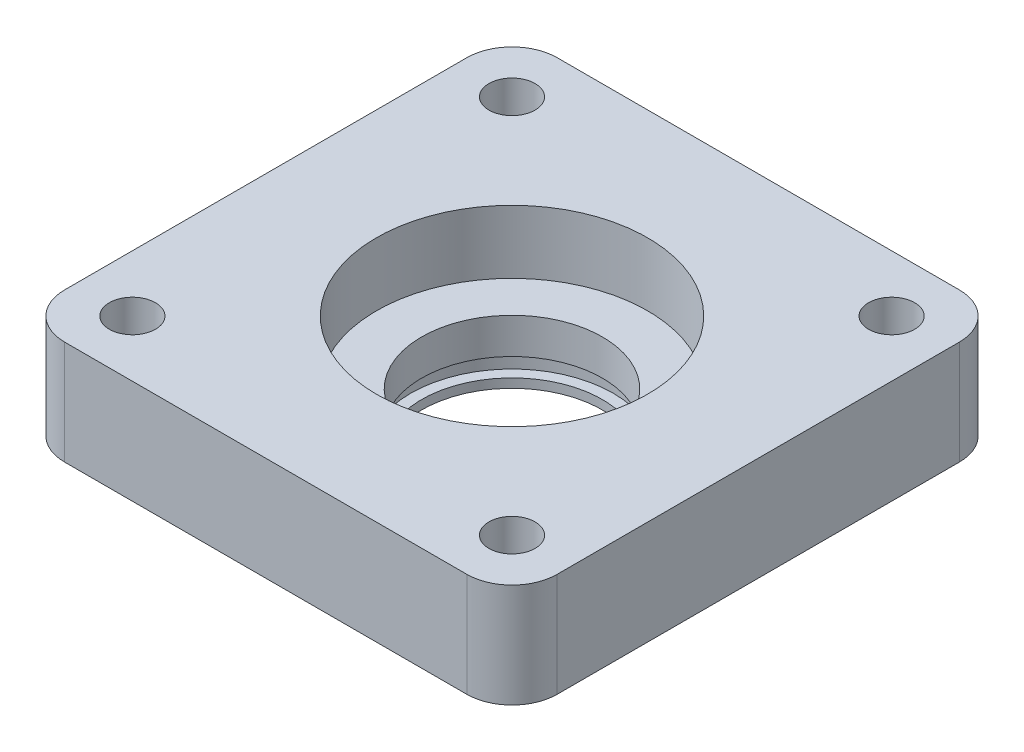
ISO-10303-21;
HEADER;
FILE_DESCRIPTION(('STEP AP214'),'2;1');
FILE_NAME('part.step','',(''),(''),'','','');
FILE_SCHEMA(('AUTOMOTIVE_DESIGN { 1 0 10303 214 1 1 1 1 }'));
ENDSEC;
DATA;
#1=APPLICATION_CONTEXT('core data for automotive mechanical design processes');
#2=APPLICATION_PROTOCOL_DEFINITION('international standard','automotive_design',2000,#1);
#3=PRODUCT_CONTEXT('',#1,'mechanical');
#4=PRODUCT('Part','Part','',(#3));
#5=PRODUCT_RELATED_PRODUCT_CATEGORY('part','',(#4));
#6=PRODUCT_DEFINITION_FORMATION('','',#4);
#7=PRODUCT_DEFINITION_CONTEXT('part definition',#1,'design');
#8=PRODUCT_DEFINITION('design','',#6,#7);
#9=PRODUCT_DEFINITION_SHAPE('','',#8);
#10=(LENGTH_UNIT() NAMED_UNIT(*) SI_UNIT(.MILLI.,.METRE.));
#11=(NAMED_UNIT(*) PLANE_ANGLE_UNIT() SI_UNIT($,.RADIAN.));
#12=(NAMED_UNIT(*) SI_UNIT($,.STERADIAN.) SOLID_ANGLE_UNIT());
#13=UNCERTAINTY_MEASURE_WITH_UNIT(LENGTH_MEASURE(1.E-05),#10,'distance_accuracy_value','');
#14=(GEOMETRIC_REPRESENTATION_CONTEXT(3) GLOBAL_UNCERTAINTY_ASSIGNED_CONTEXT((#13)) GLOBAL_UNIT_ASSIGNED_CONTEXT((#10,
#11,#12)) REPRESENTATION_CONTEXT('',''));
#15=CARTESIAN_POINT('',(0.,0.,0.));
#16=DIRECTION('',(0.,0.,1.));
#17=DIRECTION('',(1.,0.,0.));
#18=AXIS2_PLACEMENT_3D('',#15,#16,#17);
#19=CARTESIAN_POINT('',(0.,2.,20.));
#20=DIRECTION('',(0.,1.,0.));
#21=DIRECTION('',(0.,0.,1.));
#22=AXIS2_PLACEMENT_3D('',#19,#20,#21);
#23=PLANE('',#22);
#24=CARTESIAN_POINT('',(0.,2.,0.));
#25=DIRECTION('',(0.,-1.,0.));
#26=DIRECTION('',(0.,0.,-1.));
#27=AXIS2_PLACEMENT_3D('',#24,#25,#26);
#28=CIRCLE('',#27,22.4);
#29=CARTESIAN_POINT('',(0.,2.,-22.4));
#30=VERTEX_POINT('',#29);
#31=EDGE_CURVE('E19',#30,#30,#28,.F.);
#32=ORIENTED_EDGE('',*,*,#31,.T.);
#33=EDGE_LOOP('',(#32));
#34=FACE_BOUND('',#33,.T.);
#35=CARTESIAN_POINT('',(0.,2.,0.));
#36=DIRECTION('',(0.,1.,0.));
#37=DIRECTION('',(0.,0.,1.));
#38=AXIS2_PLACEMENT_3D('',#35,#36,#37);
#39=CIRCLE('',#38,20.);
#40=CARTESIAN_POINT('',(0.,2.,20.));
#41=VERTEX_POINT('',#40);
#42=EDGE_CURVE('E180',#41,#41,#39,.F.);
#43=ORIENTED_EDGE('',*,*,#42,.T.);
#44=EDGE_LOOP('',(#43));
#45=FACE_BOUND('',#44,.T.);
#46=ADVANCED_FACE('F16',(#34,#45),#23,.T.);
#47=CARTESIAN_POINT('',(0.,0.,0.));
#48=DIRECTION('',(0.,-1.,0.));
#49=DIRECTION('',(0.,0.,-1.));
#50=AXIS2_PLACEMENT_3D('',#47,#48,#49);
#51=CYLINDRICAL_SURFACE('',#50,22.4);
#52=ORIENTED_EDGE('',*,*,#31,.F.);
#53=EDGE_LOOP('',(#52));
#54=FACE_BOUND('',#53,.T.);
#55=CARTESIAN_POINT('',(0.,6.1,0.));
#56=DIRECTION('',(0.,-1.,0.));
#57=DIRECTION('',(0.,0.,-1.));
#58=AXIS2_PLACEMENT_3D('',#55,#56,#57);
#59=CIRCLE('',#58,22.4);
#60=CARTESIAN_POINT('',(0.,6.1,-22.4));
#61=VERTEX_POINT('',#60);
#62=EDGE_CURVE('E178',#61,#61,#59,.T.);
#63=ORIENTED_EDGE('',*,*,#62,.F.);
#64=EDGE_LOOP('',(#63));
#65=FACE_BOUND('',#64,.T.);
#66=ADVANCED_FACE('F188',(#54,#65),#51,.F.);
#67=CARTESIAN_POINT('',(0.,0.,0.));
#68=DIRECTION('',(0.,1.,0.));
#69=DIRECTION('',(0.,0.,1.));
#70=AXIS2_PLACEMENT_3D('',#67,#68,#69);
#71=CYLINDRICAL_SURFACE('',#70,20.);
#72=ORIENTED_EDGE('',*,*,#42,.F.);
#73=EDGE_LOOP('',(#72));
#74=FACE_BOUND('',#73,.T.);
#75=CARTESIAN_POINT('',(0.,0.,0.));
#76=DIRECTION('',(0.,1.,0.));
#77=DIRECTION('',(0.,0.,1.));
#78=AXIS2_PLACEMENT_3D('',#75,#76,#77);
#79=CIRCLE('',#78,20.);
#80=CARTESIAN_POINT('',(0.,0.,20.));
#81=VERTEX_POINT('',#80);
#82=EDGE_CURVE('E175',#81,#81,#79,.T.);
#83=ORIENTED_EDGE('',*,*,#82,.F.);
#84=EDGE_LOOP('',(#83));
#85=FACE_BOUND('',#84,.T.);
#86=ADVANCED_FACE('F191',(#74,#85),#71,.F.);
#87=CARTESIAN_POINT('',(0.,6.1,20.));
#88=DIRECTION('',(0.,-1.,0.));
#89=DIRECTION('',(0.,0.,-1.));
#90=AXIS2_PLACEMENT_3D('',#87,#88,#89);
#91=PLANE('',#90);
#92=CARTESIAN_POINT('',(0.,6.1,0.));
#93=DIRECTION('',(0.,1.,0.));
#94=DIRECTION('',(0.,0.,1.));
#95=AXIS2_PLACEMENT_3D('',#92,#93,#94);
#96=CIRCLE('',#95,20.);
#97=CARTESIAN_POINT('',(0.,6.1,20.));
#98=VERTEX_POINT('',#97);
#99=EDGE_CURVE('E172',#98,#98,#96,.T.);
#100=ORIENTED_EDGE('',*,*,#99,.T.);
#101=EDGE_LOOP('',(#100));
#102=FACE_BOUND('',#101,.T.);
#103=ORIENTED_EDGE('',*,*,#62,.T.);
#104=EDGE_LOOP('',(#103));
#105=FACE_BOUND('',#104,.T.);
#106=ADVANCED_FACE('F194',(#102,#105),#91,.T.);
#107=CARTESIAN_POINT('',(0.,0.,0.));
#108=DIRECTION('',(0.,-1.,0.));
#109=DIRECTION('',(0.,0.,-1.));
#110=AXIS2_PLACEMENT_3D('',#107,#108,#109);
#111=PLANE('',#110);
#112=CARTESIAN_POINT('',(0.,0.,0.));
#113=DIRECTION('',(0.,-1.,0.));
#114=DIRECTION('',(0.,0.,-1.));
#115=AXIS2_PLACEMENT_3D('',#112,#113,#114);
#116=CIRCLE('',#115,30.);
#117=CARTESIAN_POINT('',(0.,0.,-30.));
#118=VERTEX_POINT('',#117);
#119=EDGE_CURVE('E169',#118,#118,#116,.F.);
#120=ORIENTED_EDGE('',*,*,#119,.F.);
#121=EDGE_LOOP('',(#120));
#122=FACE_BOUND('',#121,.T.);
#123=ORIENTED_EDGE('',*,*,#82,.T.);
#124=EDGE_LOOP('',(#123));
#125=FACE_BOUND('',#124,.T.);
#126=ADVANCED_FACE('F196',(#122,#125),#111,.T.);
#127=CARTESIAN_POINT('',(0.,0.,0.));
#128=DIRECTION('',(0.,1.,0.));
#129=DIRECTION('',(0.,0.,1.));
#130=AXIS2_PLACEMENT_3D('',#127,#128,#129);
#131=CYLINDRICAL_SURFACE('',#130,20.);
#132=ORIENTED_EDGE('',*,*,#99,.F.);
#133=EDGE_LOOP('',(#132));
#134=FACE_BOUND('',#133,.T.);
#135=CARTESIAN_POINT('',(0.,14.,0.));
#136=DIRECTION('',(0.,1.,0.));
#137=DIRECTION('',(0.,0.,1.));
#138=AXIS2_PLACEMENT_3D('',#135,#136,#137);
#139=CIRCLE('',#138,20.);
#140=CARTESIAN_POINT('',(0.,14.,20.));
#141=VERTEX_POINT('',#140);
#142=EDGE_CURVE('E166',#141,#141,#139,.T.);
#143=ORIENTED_EDGE('',*,*,#142,.T.);
#144=EDGE_LOOP('',(#143));
#145=FACE_BOUND('',#144,.T.);
#146=ADVANCED_FACE('F205',(#134,#145),#131,.F.);
#147=CARTESIAN_POINT('',(0.,5.,0.));
#148=DIRECTION('',(0.,-1.,0.));
#149=DIRECTION('',(0.,0.,-1.));
#150=AXIS2_PLACEMENT_3D('',#147,#148,#149);
#151=CYLINDRICAL_SURFACE('',#150,30.);
#152=CARTESIAN_POINT('',(0.,5.,0.));
#153=DIRECTION('',(0.,-1.,0.));
#154=DIRECTION('',(0.,0.,-1.));
#155=AXIS2_PLACEMENT_3D('',#152,#153,#154);
#156=CIRCLE('',#155,30.);
#157=CARTESIAN_POINT('',(0.,5.,-30.));
#158=VERTEX_POINT('',#157);
#159=EDGE_CURVE('E163',#158,#158,#156,.F.);
#160=ORIENTED_EDGE('',*,*,#159,.F.);
#161=EDGE_LOOP('',(#160));
#162=FACE_BOUND('',#161,.T.);
#163=ORIENTED_EDGE('',*,*,#119,.T.);
#164=EDGE_LOOP('',(#163));
#165=FACE_BOUND('',#164,.T.);
#166=ADVANCED_FACE('F272',(#162,#165),#151,.T.);
#167=CARTESIAN_POINT('',(0.,14.,0.));
#168=DIRECTION('',(0.,-1.,0.));
#169=DIRECTION('',(0.,0.,-1.));
#170=AXIS2_PLACEMENT_3D('',#167,#168,#169);
#171=PLANE('',#170);
#172=CARTESIAN_POINT('',(0.,14.,0.));
#173=DIRECTION('',(0.,1.,0.));
#174=DIRECTION('',(0.,0.,1.));
#175=AXIS2_PLACEMENT_3D('',#172,#173,#174);
#176=CIRCLE('',#175,30.);
#177=CARTESIAN_POINT('',(0.,14.,30.));
#178=VERTEX_POINT('',#177);
#179=EDGE_CURVE('E93',#178,#178,#176,.T.);
#180=ORIENTED_EDGE('',*,*,#179,.T.);
#181=EDGE_LOOP('',(#180));
#182=FACE_BOUND('',#181,.T.);
#183=ORIENTED_EDGE('',*,*,#142,.F.);
#184=EDGE_LOOP('',(#183));
#185=FACE_BOUND('',#184,.T.);
#186=ADVANCED_FACE('F269',(#182,#185),#171,.F.);
#187=CARTESIAN_POINT('',(0.,5.,0.));
#188=DIRECTION('',(0.,-1.,0.));
#189=DIRECTION('',(0.,0.,-1.));
#190=AXIS2_PLACEMENT_3D('',#187,#188,#189);
#191=PLANE('',#190);
#192=DIRECTION('',(0.,0.,-1.));
#193=VECTOR('',#192,1.);
#194=CARTESIAN_POINT('',(-54.5,5.,54.5));
#195=LINE('',#194,#193);
#196=CARTESIAN_POINT('',(-54.5,5.,44.5));
#197=VERTEX_POINT('',#196);
#198=CARTESIAN_POINT('',(-54.5,5.,-44.5));
#199=VERTEX_POINT('',#198);
#200=EDGE_CURVE('E116',#197,#199,#195,.T.);
#201=ORIENTED_EDGE('',*,*,#200,.T.);
#202=CARTESIAN_POINT('',(-44.5,5.,-44.5));
#203=DIRECTION('',(0.,-1.,0.));
#204=DIRECTION('',(0.,0.,-1.));
#205=AXIS2_PLACEMENT_3D('',#202,#203,#204);
#206=CIRCLE('',#205,10.);
#207=CARTESIAN_POINT('',(-44.5,5.,-54.5));
#208=VERTEX_POINT('',#207);
#209=EDGE_CURVE('E117',#208,#199,#206,.F.);
#210=ORIENTED_EDGE('',*,*,#209,.F.);
#211=DIRECTION('',(1.,0.,0.));
#212=VECTOR('',#211,1.);
#213=CARTESIAN_POINT('',(-54.5,5.,-54.5));
#214=LINE('',#213,#212);
#215=CARTESIAN_POINT('',(44.5,5.,-54.5));
#216=VERTEX_POINT('',#215);
#217=EDGE_CURVE('E111',#208,#216,#214,.T.);
#218=ORIENTED_EDGE('',*,*,#217,.T.);
#219=CARTESIAN_POINT('',(44.5,5.,-44.5));
#220=DIRECTION('',(0.,-1.,0.));
#221=DIRECTION('',(0.,0.,-1.));
#222=AXIS2_PLACEMENT_3D('',#219,#220,#221);
#223=CIRCLE('',#222,10.);
#224=CARTESIAN_POINT('',(54.5,5.,-44.5));
#225=VERTEX_POINT('',#224);
#226=EDGE_CURVE('E114',#225,#216,#223,.F.);
#227=ORIENTED_EDGE('',*,*,#226,.F.);
#228=DIRECTION('',(0.,0.,1.));
#229=VECTOR('',#228,1.);
#230=CARTESIAN_POINT('',(54.5,5.,54.5));
#231=LINE('',#230,#229);
#232=CARTESIAN_POINT('',(54.5,5.,44.5));
#233=VERTEX_POINT('',#232);
#234=EDGE_CURVE('E87',#225,#233,#231,.T.);
#235=ORIENTED_EDGE('',*,*,#234,.T.);
#236=CARTESIAN_POINT('',(44.5,5.,44.5));
#237=DIRECTION('',(0.,-1.,0.));
#238=DIRECTION('',(0.,0.,-1.));
#239=AXIS2_PLACEMENT_3D('',#236,#237,#238);
#240=CIRCLE('',#239,10.);
#241=CARTESIAN_POINT('',(44.5,5.,54.5));
#242=VERTEX_POINT('',#241);
#243=EDGE_CURVE('E80',#242,#233,#240,.F.);
#244=ORIENTED_EDGE('',*,*,#243,.F.);
#245=DIRECTION('',(-1.,0.,0.));
#246=VECTOR('',#245,1.);
#247=CARTESIAN_POINT('',(-54.5,5.,54.5));
#248=LINE('',#247,#246);
#249=CARTESIAN_POINT('',(-44.5,5.,54.5));
#250=VERTEX_POINT('',#249);
#251=EDGE_CURVE('E85',#242,#250,#248,.T.);
#252=ORIENTED_EDGE('',*,*,#251,.T.);
#253=CARTESIAN_POINT('',(-44.5,5.,44.5));
#254=DIRECTION('',(0.,-1.,0.));
#255=DIRECTION('',(0.,0.,-1.));
#256=AXIS2_PLACEMENT_3D('',#253,#254,#255);
#257=CIRCLE('',#256,10.);
#258=EDGE_CURVE('E100',#197,#250,#257,.F.);
#259=ORIENTED_EDGE('',*,*,#258,.F.);
#260=EDGE_LOOP('',(#201,#210,#218,#227,#235,#244,#252,#259));
#261=FACE_BOUND('',#260,.T.);
#262=ORIENTED_EDGE('',*,*,#159,.T.);
#263=EDGE_LOOP('',(#262));
#264=FACE_BOUND('',#263,.T.);
#265=CARTESIAN_POINT('',(42.,5.,42.));
#266=DIRECTION('',(0.,1.,0.));
#267=DIRECTION('',(0.,0.,1.));
#268=AXIS2_PLACEMENT_3D('',#265,#266,#267);
#269=CIRCLE('',#268,5.1);
#270=CARTESIAN_POINT('',(42.,5.,47.1));
#271=VERTEX_POINT('',#270);
#272=EDGE_CURVE('E110',#271,#271,#269,.T.);
#273=ORIENTED_EDGE('',*,*,#272,.T.);
#274=EDGE_LOOP('',(#273));
#275=FACE_BOUND('',#274,.T.);
#276=CARTESIAN_POINT('',(42.,5.,-42.));
#277=DIRECTION('',(0.,1.,0.));
#278=DIRECTION('',(0.,0.,1.));
#279=AXIS2_PLACEMENT_3D('',#276,#277,#278);
#280=CIRCLE('',#279,5.1);
#281=CARTESIAN_POINT('',(42.,5.,-36.9));
#282=VERTEX_POINT('',#281);
#283=EDGE_CURVE('E148',#282,#282,#280,.T.);
#284=ORIENTED_EDGE('',*,*,#283,.T.);
#285=EDGE_LOOP('',(#284));
#286=FACE_BOUND('',#285,.T.);
#287=CARTESIAN_POINT('',(-42.,5.,42.));
#288=DIRECTION('',(0.,1.,0.));
#289=DIRECTION('',(0.,0.,1.));
#290=AXIS2_PLACEMENT_3D('',#287,#288,#289);
#291=CIRCLE('',#290,5.1);
#292=CARTESIAN_POINT('',(-42.,5.,47.1));
#293=VERTEX_POINT('',#292);
#294=EDGE_CURVE('E160',#293,#293,#291,.T.);
#295=ORIENTED_EDGE('',*,*,#294,.T.);
#296=EDGE_LOOP('',(#295));
#297=FACE_BOUND('',#296,.T.);
#298=CARTESIAN_POINT('',(-42.,5.,-42.));
#299=DIRECTION('',(0.,1.,0.));
#300=DIRECTION('',(0.,0.,1.));
#301=AXIS2_PLACEMENT_3D('',#298,#299,#300);
#302=CIRCLE('',#301,5.1);
#303=CARTESIAN_POINT('',(-42.,5.,-36.9));
#304=VERTEX_POINT('',#303);
#305=EDGE_CURVE('E145',#304,#304,#302,.T.);
#306=ORIENTED_EDGE('',*,*,#305,.T.);
#307=EDGE_LOOP('',(#306));
#308=FACE_BOUND('',#307,.T.);
#309=ADVANCED_FACE('F83',(#261,#264,#275,#286,#297,#308),#191,.T.);
#310=CARTESIAN_POINT('',(-42.,28.,42.));
#311=DIRECTION('',(0.,1.,0.));
#312=DIRECTION('',(0.,0.,1.));
#313=AXIS2_PLACEMENT_3D('',#310,#311,#312);
#314=CYLINDRICAL_SURFACE('',#313,5.1);
#315=ORIENTED_EDGE('',*,*,#294,.F.);
#316=EDGE_LOOP('',(#315));
#317=FACE_BOUND('',#316,.T.);
#318=CARTESIAN_POINT('',(-42.,28.,42.));
#319=DIRECTION('',(0.,1.,0.));
#320=DIRECTION('',(0.,0.,1.));
#321=AXIS2_PLACEMENT_3D('',#318,#319,#320);
#322=CIRCLE('',#321,5.1);
#323=CARTESIAN_POINT('',(-42.,28.,47.1));
#324=VERTEX_POINT('',#323);
#325=EDGE_CURVE('E142',#324,#324,#322,.T.);
#326=ORIENTED_EDGE('',*,*,#325,.T.);
#327=EDGE_LOOP('',(#326));
#328=FACE_BOUND('',#327,.T.);
#329=ADVANCED_FACE('F262',(#317,#328),#314,.F.);
#330=CARTESIAN_POINT('',(0.,14.,0.));
#331=DIRECTION('',(0.,1.,0.));
#332=DIRECTION('',(0.,0.,1.));
#333=AXIS2_PLACEMENT_3D('',#330,#331,#332);
#334=CYLINDRICAL_SURFACE('',#333,30.);
#335=CARTESIAN_POINT('',(0.,28.,0.));
#336=DIRECTION('',(0.,1.,0.));
#337=DIRECTION('',(0.,0.,1.));
#338=AXIS2_PLACEMENT_3D('',#335,#336,#337);
#339=CIRCLE('',#338,30.);
#340=CARTESIAN_POINT('',(0.,28.,30.));
#341=VERTEX_POINT('',#340);
#342=EDGE_CURVE('E139',#341,#341,#339,.T.);
#343=ORIENTED_EDGE('',*,*,#342,.T.);
#344=EDGE_LOOP('',(#343));
#345=FACE_BOUND('',#344,.T.);
#346=ORIENTED_EDGE('',*,*,#179,.F.);
#347=EDGE_LOOP('',(#346));
#348=FACE_BOUND('',#347,.T.);
#349=ADVANCED_FACE('F259',(#345,#348),#334,.F.);
#350=CARTESIAN_POINT('',(44.5,28.,44.5));
#351=DIRECTION('',(0.,-1.,0.));
#352=DIRECTION('',(0.,0.,-1.));
#353=AXIS2_PLACEMENT_3D('',#350,#351,#352);
#354=CYLINDRICAL_SURFACE('',#353,10.);
#355=ORIENTED_EDGE('',*,*,#243,.T.);
#356=DIRECTION('',(0.,1.,0.));
#357=VECTOR('',#356,1.);
#358=CARTESIAN_POINT('',(54.5,28.,44.5));
#359=LINE('',#358,#357);
#360=CARTESIAN_POINT('',(54.5,28.,44.5));
#361=VERTEX_POINT('',#360);
#362=EDGE_CURVE('E464',#233,#361,#359,.T.);
#363=ORIENTED_EDGE('',*,*,#362,.T.);
#364=CARTESIAN_POINT('',(44.5,28.,44.5));
#365=DIRECTION('',(0.,-1.,0.));
#366=DIRECTION('',(0.,0.,-1.));
#367=AXIS2_PLACEMENT_3D('',#364,#365,#366);
#368=CIRCLE('',#367,10.);
#369=CARTESIAN_POINT('',(44.5,28.,54.5));
#370=VERTEX_POINT('',#369);
#371=EDGE_CURVE('E104',#361,#370,#368,.T.);
#372=ORIENTED_EDGE('',*,*,#371,.T.);
#373=DIRECTION('',(0.,1.,0.));
#374=VECTOR('',#373,1.);
#375=CARTESIAN_POINT('',(44.5,28.,54.5));
#376=LINE('',#375,#374);
#377=EDGE_CURVE('E92',#370,#242,#376,.F.);
#378=ORIENTED_EDGE('',*,*,#377,.T.);
#379=EDGE_LOOP('',(#355,#363,#372,#378));
#380=FACE_BOUND('',#379,.T.);
#381=ADVANCED_FACE('F103',(#380),#354,.T.);
#382=CARTESIAN_POINT('',(-54.5,28.,54.5));
#383=DIRECTION('',(0.,0.,-1.));
#384=DIRECTION('',(-1.,0.,0.));
#385=AXIS2_PLACEMENT_3D('',#382,#383,#384);
#386=PLANE('',#385);
#387=ORIENTED_EDGE('',*,*,#377,.F.);
#388=DIRECTION('',(1.,0.,0.));
#389=VECTOR('',#388,1.);
#390=CARTESIAN_POINT('',(0.,28.,54.5));
#391=LINE('',#390,#389);
#392=CARTESIAN_POINT('',(-44.5,28.,54.5));
#393=VERTEX_POINT('',#392);
#394=EDGE_CURVE('E137',#370,#393,#391,.F.);
#395=ORIENTED_EDGE('',*,*,#394,.T.);
#396=DIRECTION('',(0.,-1.,0.));
#397=VECTOR('',#396,1.);
#398=CARTESIAN_POINT('',(-44.5,28.,54.5));
#399=LINE('',#398,#397);
#400=EDGE_CURVE('E99',#250,#393,#399,.F.);
#401=ORIENTED_EDGE('',*,*,#400,.F.);
#402=ORIENTED_EDGE('',*,*,#251,.F.);
#403=EDGE_LOOP('',(#387,#395,#401,#402));
#404=FACE_BOUND('',#403,.T.);
#405=ADVANCED_FACE('F96',(#404),#386,.F.);
#406=CARTESIAN_POINT('',(-44.5,28.,44.5));
#407=DIRECTION('',(0.,-1.,0.));
#408=DIRECTION('',(0.,0.,-1.));
#409=AXIS2_PLACEMENT_3D('',#406,#407,#408);
#410=CYLINDRICAL_SURFACE('',#409,10.);
#411=ORIENTED_EDGE('',*,*,#258,.T.);
#412=ORIENTED_EDGE('',*,*,#400,.T.);
#413=CARTESIAN_POINT('',(-44.5,28.,44.5));
#414=DIRECTION('',(0.,-1.,0.));
#415=DIRECTION('',(0.,0.,-1.));
#416=AXIS2_PLACEMENT_3D('',#413,#414,#415);
#417=CIRCLE('',#416,10.);
#418=CARTESIAN_POINT('',(-54.5,28.,44.5));
#419=VERTEX_POINT('',#418);
#420=EDGE_CURVE('E134',#393,#419,#417,.T.);
#421=ORIENTED_EDGE('',*,*,#420,.T.);
#422=DIRECTION('',(0.,1.,0.));
#423=VECTOR('',#422,1.);
#424=CARTESIAN_POINT('',(-54.5,28.,44.5));
#425=LINE('',#424,#423);
#426=EDGE_CURVE('E118',#419,#197,#425,.F.);
#427=ORIENTED_EDGE('',*,*,#426,.T.);
#428=EDGE_LOOP('',(#411,#412,#421,#427));
#429=FACE_BOUND('',#428,.T.);
#430=ADVANCED_FACE('F250',(#429),#410,.T.);
#431=CARTESIAN_POINT('',(-54.5,28.,54.5));
#432=DIRECTION('',(1.,0.,0.));
#433=DIRECTION('',(0.,0.,-1.));
#434=AXIS2_PLACEMENT_3D('',#431,#432,#433);
#435=PLANE('',#434);
#436=ORIENTED_EDGE('',*,*,#426,.F.);
#437=DIRECTION('',(0.,0.,-1.));
#438=VECTOR('',#437,1.);
#439=CARTESIAN_POINT('',(-54.5,28.,0.));
#440=LINE('',#439,#438);
#441=CARTESIAN_POINT('',(-54.5,28.,-44.5));
#442=VERTEX_POINT('',#441);
#443=EDGE_CURVE('E133',#419,#442,#440,.T.);
#444=ORIENTED_EDGE('',*,*,#443,.T.);
#445=DIRECTION('',(0.,-1.,0.));
#446=VECTOR('',#445,1.);
#447=CARTESIAN_POINT('',(-54.5,28.,-44.5));
#448=LINE('',#447,#446);
#449=EDGE_CURVE('E156',#199,#442,#448,.F.);
#450=ORIENTED_EDGE('',*,*,#449,.F.);
#451=ORIENTED_EDGE('',*,*,#200,.F.);
#452=EDGE_LOOP('',(#436,#444,#450,#451));
#453=FACE_BOUND('',#452,.T.);
#454=ADVANCED_FACE('F246',(#453),#435,.F.);
#455=CARTESIAN_POINT('',(-44.5,28.,-44.5));
#456=DIRECTION('',(0.,-1.,0.));
#457=DIRECTION('',(0.,0.,-1.));
#458=AXIS2_PLACEMENT_3D('',#455,#456,#457);
#459=CYLINDRICAL_SURFACE('',#458,10.);
#460=ORIENTED_EDGE('',*,*,#209,.T.);
#461=ORIENTED_EDGE('',*,*,#449,.T.);
#462=CARTESIAN_POINT('',(-44.5,28.,-44.5));
#463=DIRECTION('',(0.,-1.,0.));
#464=DIRECTION('',(0.,0.,-1.));
#465=AXIS2_PLACEMENT_3D('',#462,#463,#464);
#466=CIRCLE('',#465,10.);
#467=CARTESIAN_POINT('',(-44.5,28.,-54.5));
#468=VERTEX_POINT('',#467);
#469=EDGE_CURVE('E130',#442,#468,#466,.T.);
#470=ORIENTED_EDGE('',*,*,#469,.T.);
#471=DIRECTION('',(0.,1.,0.));
#472=VECTOR('',#471,1.);
#473=CARTESIAN_POINT('',(-44.5,28.,-54.5));
#474=LINE('',#473,#472);
#475=EDGE_CURVE('E115',#468,#208,#474,.F.);
#476=ORIENTED_EDGE('',*,*,#475,.T.);
#477=EDGE_LOOP('',(#460,#461,#470,#476));
#478=FACE_BOUND('',#477,.T.);
#479=ADVANCED_FACE('F242',(#478),#459,.T.);
#480=CARTESIAN_POINT('',(-54.5,28.,-54.5));
#481=DIRECTION('',(0.,0.,1.));
#482=DIRECTION('',(1.,0.,0.));
#483=AXIS2_PLACEMENT_3D('',#480,#481,#482);
#484=PLANE('',#483);
#485=DIRECTION('',(0.,-1.,0.));
#486=VECTOR('',#485,1.);
#487=CARTESIAN_POINT('',(44.5,28.,-54.5));
#488=LINE('',#487,#486);
#489=CARTESIAN_POINT('',(44.5,28.,-54.5));
#490=VERTEX_POINT('',#489);
#491=EDGE_CURVE('E154',#216,#490,#488,.F.);
#492=ORIENTED_EDGE('',*,*,#491,.F.);
#493=ORIENTED_EDGE('',*,*,#217,.F.);
#494=ORIENTED_EDGE('',*,*,#475,.F.);
#495=DIRECTION('',(1.,0.,0.));
#496=VECTOR('',#495,1.);
#497=CARTESIAN_POINT('',(0.,28.,-54.5));
#498=LINE('',#497,#496);
#499=EDGE_CURVE('E129',#468,#490,#498,.T.);
#500=ORIENTED_EDGE('',*,*,#499,.T.);
#501=EDGE_LOOP('',(#492,#493,#494,#500));
#502=FACE_BOUND('',#501,.T.);
#503=ADVANCED_FACE('F238',(#502),#484,.F.);
#504=CARTESIAN_POINT('',(44.5,28.,-44.5));
#505=DIRECTION('',(0.,-1.,0.));
#506=DIRECTION('',(0.,0.,-1.));
#507=AXIS2_PLACEMENT_3D('',#504,#505,#506);
#508=CYLINDRICAL_SURFACE('',#507,10.);
#509=ORIENTED_EDGE('',*,*,#226,.T.);
#510=ORIENTED_EDGE('',*,*,#491,.T.);
#511=CARTESIAN_POINT('',(44.5,28.,-44.5));
#512=DIRECTION('',(0.,-1.,0.));
#513=DIRECTION('',(0.,0.,-1.));
#514=AXIS2_PLACEMENT_3D('',#511,#512,#513);
#515=CIRCLE('',#514,10.);
#516=CARTESIAN_POINT('',(54.5,28.,-44.5));
#517=VERTEX_POINT('',#516);
#518=EDGE_CURVE('E126',#490,#517,#515,.T.);
#519=ORIENTED_EDGE('',*,*,#518,.T.);
#520=DIRECTION('',(0.,1.,0.));
#521=VECTOR('',#520,1.);
#522=CARTESIAN_POINT('',(54.5,28.,-44.5));
#523=LINE('',#522,#521);
#524=EDGE_CURVE('E34',#517,#225,#523,.F.);
#525=ORIENTED_EDGE('',*,*,#524,.T.);
#526=EDGE_LOOP('',(#509,#510,#519,#525));
#527=FACE_BOUND('',#526,.T.);
#528=ADVANCED_FACE('F235',(#527),#508,.T.);
#529=CARTESIAN_POINT('',(54.5,28.,54.5));
#530=DIRECTION('',(-1.,0.,0.));
#531=DIRECTION('',(0.,0.,1.));
#532=AXIS2_PLACEMENT_3D('',#529,#530,#531);
#533=PLANE('',#532);
#534=ORIENTED_EDGE('',*,*,#524,.F.);
#535=DIRECTION('',(0.,0.,-1.));
#536=VECTOR('',#535,1.);
#537=CARTESIAN_POINT('',(54.5,28.,0.));
#538=LINE('',#537,#536);
#539=EDGE_CURVE('E125',#517,#361,#538,.F.);
#540=ORIENTED_EDGE('',*,*,#539,.T.);
#541=ORIENTED_EDGE('',*,*,#362,.F.);
#542=ORIENTED_EDGE('',*,*,#234,.F.);
#543=EDGE_LOOP('',(#534,#540,#541,#542));
#544=FACE_BOUND('',#543,.T.);
#545=ADVANCED_FACE('F231',(#544),#533,.F.);
#546=CARTESIAN_POINT('',(42.,28.,42.));
#547=DIRECTION('',(0.,1.,0.));
#548=DIRECTION('',(0.,0.,1.));
#549=AXIS2_PLACEMENT_3D('',#546,#547,#548);
#550=CYLINDRICAL_SURFACE('',#549,5.1);
#551=ORIENTED_EDGE('',*,*,#272,.F.);
#552=EDGE_LOOP('',(#551));
#553=FACE_BOUND('',#552,.T.);
#554=CARTESIAN_POINT('',(42.,28.,42.));
#555=DIRECTION('',(0.,1.,0.));
#556=DIRECTION('',(0.,0.,1.));
#557=AXIS2_PLACEMENT_3D('',#554,#555,#556);
#558=CIRCLE('',#557,5.1);
#559=CARTESIAN_POINT('',(42.,28.,47.1));
#560=VERTEX_POINT('',#559);
#561=EDGE_CURVE('E122',#560,#560,#558,.T.);
#562=ORIENTED_EDGE('',*,*,#561,.T.);
#563=EDGE_LOOP('',(#562));
#564=FACE_BOUND('',#563,.T.);
#565=ADVANCED_FACE('F227',(#553,#564),#550,.F.);
#566=CARTESIAN_POINT('',(42.,28.,-42.));
#567=DIRECTION('',(0.,1.,0.));
#568=DIRECTION('',(0.,0.,1.));
#569=AXIS2_PLACEMENT_3D('',#566,#567,#568);
#570=CYLINDRICAL_SURFACE('',#569,5.1);
#571=ORIENTED_EDGE('',*,*,#283,.F.);
#572=EDGE_LOOP('',(#571));
#573=FACE_BOUND('',#572,.T.);
#574=CARTESIAN_POINT('',(42.,28.,-42.));
#575=DIRECTION('',(0.,1.,0.));
#576=DIRECTION('',(0.,0.,1.));
#577=AXIS2_PLACEMENT_3D('',#574,#575,#576);
#578=CIRCLE('',#577,5.1);
#579=CARTESIAN_POINT('',(42.,28.,-36.9));
#580=VERTEX_POINT('',#579);
#581=EDGE_CURVE('E25',#580,#580,#578,.T.);
#582=ORIENTED_EDGE('',*,*,#581,.T.);
#583=EDGE_LOOP('',(#582));
#584=FACE_BOUND('',#583,.T.);
#585=ADVANCED_FACE('F219',(#573,#584),#570,.F.);
#586=CARTESIAN_POINT('',(-42.,28.,-42.));
#587=DIRECTION('',(0.,1.,0.));
#588=DIRECTION('',(0.,0.,1.));
#589=AXIS2_PLACEMENT_3D('',#586,#587,#588);
#590=CYLINDRICAL_SURFACE('',#589,5.1);
#591=ORIENTED_EDGE('',*,*,#305,.F.);
#592=EDGE_LOOP('',(#591));
#593=FACE_BOUND('',#592,.T.);
#594=CARTESIAN_POINT('',(-42.,28.,-42.));
#595=DIRECTION('',(0.,1.,0.));
#596=DIRECTION('',(0.,0.,1.));
#597=AXIS2_PLACEMENT_3D('',#594,#595,#596);
#598=CIRCLE('',#597,5.1);
#599=CARTESIAN_POINT('',(-42.,28.,-36.9));
#600=VERTEX_POINT('',#599);
#601=EDGE_CURVE('E11',#600,#600,#598,.T.);
#602=ORIENTED_EDGE('',*,*,#601,.T.);
#603=EDGE_LOOP('',(#602));
#604=FACE_BOUND('',#603,.T.);
#605=ADVANCED_FACE('F212',(#593,#604),#590,.F.);
#606=CARTESIAN_POINT('',(0.,28.,0.));
#607=DIRECTION('',(0.,-1.,0.));
#608=DIRECTION('',(0.,0.,-1.));
#609=AXIS2_PLACEMENT_3D('',#606,#607,#608);
#610=PLANE('',#609);
#611=ORIENTED_EDGE('',*,*,#601,.F.);
#612=EDGE_LOOP('',(#611));
#613=FACE_BOUND('',#612,.T.);
#614=ORIENTED_EDGE('',*,*,#581,.F.);
#615=EDGE_LOOP('',(#614));
#616=FACE_BOUND('',#615,.T.);
#617=ORIENTED_EDGE('',*,*,#561,.F.);
#618=EDGE_LOOP('',(#617));
#619=FACE_BOUND('',#618,.T.);
#620=ORIENTED_EDGE('',*,*,#518,.F.);
#621=ORIENTED_EDGE('',*,*,#499,.F.);
#622=ORIENTED_EDGE('',*,*,#469,.F.);
#623=ORIENTED_EDGE('',*,*,#443,.F.);
#624=ORIENTED_EDGE('',*,*,#420,.F.);
#625=ORIENTED_EDGE('',*,*,#394,.F.);
#626=ORIENTED_EDGE('',*,*,#371,.F.);
#627=ORIENTED_EDGE('',*,*,#539,.F.);
#628=EDGE_LOOP('',(#620,#621,#622,#623,#624,#625,#626,#627));
#629=FACE_BOUND('',#628,.T.);
#630=ORIENTED_EDGE('',*,*,#342,.F.);
#631=EDGE_LOOP('',(#630));
#632=FACE_BOUND('',#631,.T.);
#633=ORIENTED_EDGE('',*,*,#325,.F.);
#634=EDGE_LOOP('',(#633));
#635=FACE_BOUND('',#634,.T.);
#636=ADVANCED_FACE('F210',(#613,#616,#619,#629,#632,#635),#610,.F.);
#637=CLOSED_SHELL('',(#46,#66,#86,#106,#126,#146,#166,#186,#309,#329,#349,#381,#405,#430,#454,
#479,#503,#528,#545,#565,#585,#605,#636));
#638=MANIFOLD_SOLID_BREP('B1',#637);
#639=ADVANCED_BREP_SHAPE_REPRESENTATION('',(#18,#638),#14);
#640=SHAPE_DEFINITION_REPRESENTATION(#9,#639);
ENDSEC;
END-ISO-10303-21;
